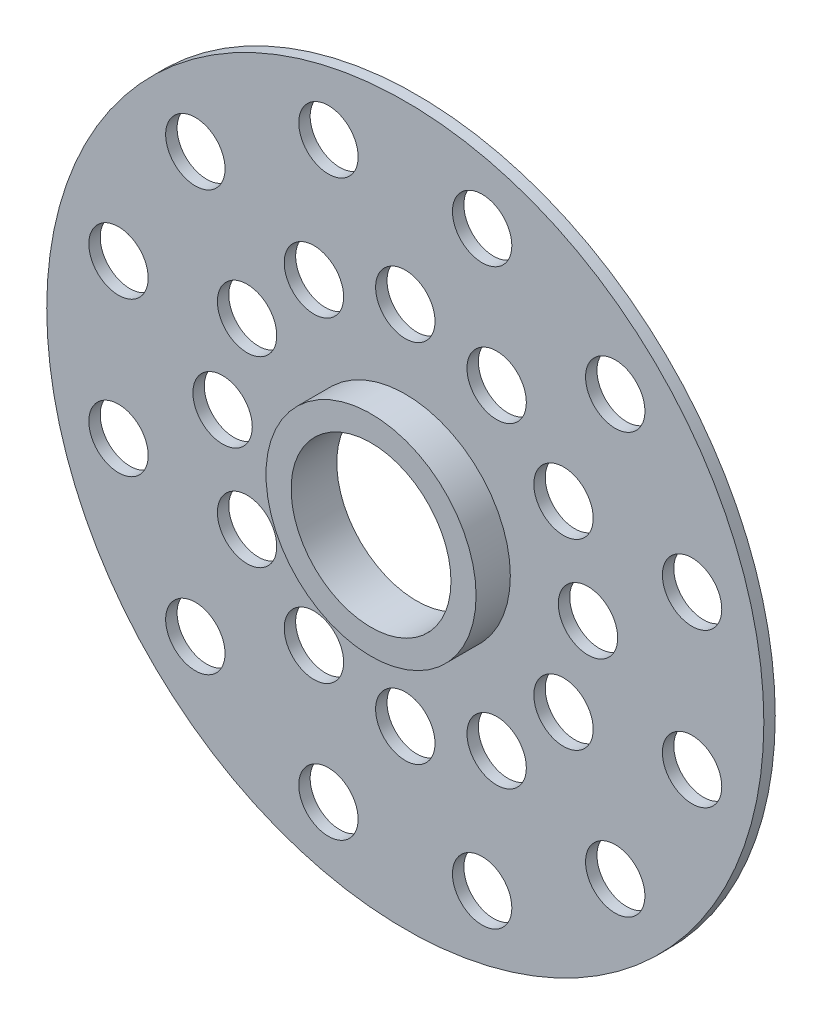
ISO-10303-21;
HEADER;
FILE_DESCRIPTION(('STEP AP214'),'2;1');
FILE_NAME('part.step','',(''),(''),'','','');
FILE_SCHEMA(('AUTOMOTIVE_DESIGN { 1 0 10303 214 1 1 1 1 }'));
ENDSEC;
DATA;
#1=APPLICATION_CONTEXT('core data for automotive mechanical design processes');
#2=APPLICATION_PROTOCOL_DEFINITION('international standard','automotive_design',2000,#1);
#3=PRODUCT_CONTEXT('',#1,'mechanical');
#4=PRODUCT('Part','Part','',(#3));
#5=PRODUCT_RELATED_PRODUCT_CATEGORY('part','',(#4));
#6=PRODUCT_DEFINITION_FORMATION('','',#4);
#7=PRODUCT_DEFINITION_CONTEXT('part definition',#1,'design');
#8=PRODUCT_DEFINITION('design','',#6,#7);
#9=PRODUCT_DEFINITION_SHAPE('','',#8);
#10=(LENGTH_UNIT() NAMED_UNIT(*) SI_UNIT(.MILLI.,.METRE.));
#11=(NAMED_UNIT(*) PLANE_ANGLE_UNIT() SI_UNIT($,.RADIAN.));
#12=(NAMED_UNIT(*) SI_UNIT($,.STERADIAN.) SOLID_ANGLE_UNIT());
#13=UNCERTAINTY_MEASURE_WITH_UNIT(LENGTH_MEASURE(1.E-05),#10,'distance_accuracy_value','');
#14=(GEOMETRIC_REPRESENTATION_CONTEXT(3) GLOBAL_UNCERTAINTY_ASSIGNED_CONTEXT((#13)) GLOBAL_UNIT_ASSIGNED_CONTEXT((#10,
#11,#12)) REPRESENTATION_CONTEXT('',''));
#15=CARTESIAN_POINT('',(0.,0.,0.));
#16=DIRECTION('',(0.,0.,1.));
#17=DIRECTION('',(1.,0.,0.));
#18=AXIS2_PLACEMENT_3D('',#15,#16,#17);
#19=CARTESIAN_POINT('',(0.,0.,-44.5));
#20=DIRECTION('',(0.,0.,1.));
#21=DIRECTION('',(1.,0.,0.));
#22=AXIS2_PLACEMENT_3D('',#19,#20,#21);
#23=PLANE('',#22);
#24=CARTESIAN_POINT('',(-45.9619407771256,45.9619407771256,-44.5));
#25=DIRECTION('',(0.,0.,1.));
#26=DIRECTION('',(1.,0.,0.));
#27=AXIS2_PLACEMENT_3D('',#24,#25,#26);
#28=CIRCLE('',#27,6.5);
#29=CARTESIAN_POINT('',(-39.4619407771256,45.9619407771256,-44.5));
#30=VERTEX_POINT('',#29);
#31=EDGE_CURVE('E185',#30,#30,#28,.T.);
#32=ORIENTED_EDGE('',*,*,#31,.F.);
#33=EDGE_LOOP('',(#32));
#34=FACE_BOUND('',#33,.T.);
#35=CARTESIAN_POINT('',(-16.8232379316639,62.7851787087894,-44.5));
#36=DIRECTION('',(0.,0.,1.));
#37=DIRECTION('',(1.,0.,0.));
#38=AXIS2_PLACEMENT_3D('',#35,#36,#37);
#39=CIRCLE('',#38,6.5);
#40=CARTESIAN_POINT('',(-10.3232379316639,62.7851787087894,-44.5));
#41=VERTEX_POINT('',#40);
#42=EDGE_CURVE('E169',#41,#41,#39,.T.);
#43=ORIENTED_EDGE('',*,*,#42,.F.);
#44=EDGE_LOOP('',(#43));
#45=FACE_BOUND('',#44,.T.);
#46=CARTESIAN_POINT('',(16.8232379316638,62.7851787087894,-44.5));
#47=DIRECTION('',(0.,0.,1.));
#48=DIRECTION('',(1.,0.,0.));
#49=AXIS2_PLACEMENT_3D('',#46,#47,#48);
#50=CIRCLE('',#49,6.5);
#51=CARTESIAN_POINT('',(23.3232379316638,62.7851787087894,-44.5));
#52=VERTEX_POINT('',#51);
#53=EDGE_CURVE('E165',#52,#52,#50,.T.);
#54=ORIENTED_EDGE('',*,*,#53,.F.);
#55=EDGE_LOOP('',(#54));
#56=FACE_BOUND('',#55,.T.);
#57=CARTESIAN_POINT('',(45.9619407771256,45.9619407771256,-44.5));
#58=DIRECTION('',(0.,0.,1.));
#59=DIRECTION('',(1.,0.,0.));
#60=AXIS2_PLACEMENT_3D('',#57,#58,#59);
#61=CIRCLE('',#60,6.5);
#62=CARTESIAN_POINT('',(52.4619407771256,45.9619407771256,-44.5));
#63=VERTEX_POINT('',#62);
#64=EDGE_CURVE('E161',#63,#63,#61,.T.);
#65=ORIENTED_EDGE('',*,*,#64,.F.);
#66=EDGE_LOOP('',(#65));
#67=FACE_BOUND('',#66,.T.);
#68=CARTESIAN_POINT('',(62.7851787087894,16.8232379316638,-44.5));
#69=DIRECTION('',(0.,0.,1.));
#70=DIRECTION('',(1.,0.,0.));
#71=AXIS2_PLACEMENT_3D('',#68,#69,#70);
#72=CIRCLE('',#71,6.50000000000001);
#73=CARTESIAN_POINT('',(69.2851787087894,16.8232379316638,-44.5));
#74=VERTEX_POINT('',#73);
#75=EDGE_CURVE('E156',#74,#74,#72,.T.);
#76=ORIENTED_EDGE('',*,*,#75,.F.);
#77=EDGE_LOOP('',(#76));
#78=FACE_BOUND('',#77,.T.);
#79=CARTESIAN_POINT('',(34.6410161513775,-20.,-44.5));
#80=DIRECTION('',(0.,0.,1.));
#81=DIRECTION('',(1.,0.,0.));
#82=AXIS2_PLACEMENT_3D('',#79,#80,#81);
#83=CIRCLE('',#82,6.5);
#84=CARTESIAN_POINT('',(41.1410161513775,-20.,-44.5));
#85=VERTEX_POINT('',#84);
#86=EDGE_CURVE('E151',#85,#85,#83,.T.);
#87=ORIENTED_EDGE('',*,*,#86,.F.);
#88=EDGE_LOOP('',(#87));
#89=FACE_BOUND('',#88,.T.);
#90=CARTESIAN_POINT('',(20.,-34.6410161513775,-44.5));
#91=DIRECTION('',(0.,0.,1.));
#92=DIRECTION('',(1.,0.,0.));
#93=AXIS2_PLACEMENT_3D('',#90,#91,#92);
#94=CIRCLE('',#93,6.5);
#95=CARTESIAN_POINT('',(26.5,-34.6410161513775,-44.5));
#96=VERTEX_POINT('',#95);
#97=EDGE_CURVE('E146',#96,#96,#94,.T.);
#98=ORIENTED_EDGE('',*,*,#97,.F.);
#99=EDGE_LOOP('',(#98));
#100=FACE_BOUND('',#99,.T.);
#101=CARTESIAN_POINT('',(0.,-40.,-44.5));
#102=DIRECTION('',(0.,0.,1.));
#103=DIRECTION('',(1.,0.,0.));
#104=AXIS2_PLACEMENT_3D('',#101,#102,#103);
#105=CIRCLE('',#104,6.5);
#106=CARTESIAN_POINT('',(6.49999999999999,-40.,-44.5));
#107=VERTEX_POINT('',#106);
#108=EDGE_CURVE('E141',#107,#107,#105,.T.);
#109=ORIENTED_EDGE('',*,*,#108,.F.);
#110=EDGE_LOOP('',(#109));
#111=FACE_BOUND('',#110,.T.);
#112=CARTESIAN_POINT('',(34.6410161513775,20.,-44.5));
#113=DIRECTION('',(0.,0.,1.));
#114=DIRECTION('',(1.,0.,0.));
#115=AXIS2_PLACEMENT_3D('',#112,#113,#114);
#116=CIRCLE('',#115,6.5);
#117=CARTESIAN_POINT('',(41.1410161513775,20.,-44.5));
#118=VERTEX_POINT('',#117);
#119=EDGE_CURVE('E136',#118,#118,#116,.T.);
#120=ORIENTED_EDGE('',*,*,#119,.F.);
#121=EDGE_LOOP('',(#120));
#122=FACE_BOUND('',#121,.T.);
#123=CARTESIAN_POINT('',(20.,34.6410161513775,-44.5));
#124=DIRECTION('',(0.,0.,1.));
#125=DIRECTION('',(1.,0.,0.));
#126=AXIS2_PLACEMENT_3D('',#123,#124,#125);
#127=CIRCLE('',#126,6.5);
#128=CARTESIAN_POINT('',(26.5,34.6410161513775,-44.5));
#129=VERTEX_POINT('',#128);
#130=EDGE_CURVE('E131',#129,#129,#127,.T.);
#131=ORIENTED_EDGE('',*,*,#130,.F.);
#132=EDGE_LOOP('',(#131));
#133=FACE_BOUND('',#132,.T.);
#134=CARTESIAN_POINT('',(0.,40.,-44.5));
#135=DIRECTION('',(0.,0.,1.));
#136=DIRECTION('',(1.,0.,0.));
#137=AXIS2_PLACEMENT_3D('',#134,#135,#136);
#138=CIRCLE('',#137,6.5);
#139=CARTESIAN_POINT('',(6.5,40.,-44.5));
#140=VERTEX_POINT('',#139);
#141=EDGE_CURVE('E126',#140,#140,#138,.T.);
#142=ORIENTED_EDGE('',*,*,#141,.F.);
#143=EDGE_LOOP('',(#142));
#144=FACE_BOUND('',#143,.T.);
#145=CARTESIAN_POINT('',(-20.,34.6410161513775,-44.5));
#146=DIRECTION('',(0.,0.,1.));
#147=DIRECTION('',(1.,0.,0.));
#148=AXIS2_PLACEMENT_3D('',#145,#146,#147);
#149=CIRCLE('',#148,6.5);
#150=CARTESIAN_POINT('',(-13.5,34.6410161513775,-44.5));
#151=VERTEX_POINT('',#150);
#152=EDGE_CURVE('E121',#151,#151,#149,.T.);
#153=ORIENTED_EDGE('',*,*,#152,.F.);
#154=EDGE_LOOP('',(#153));
#155=FACE_BOUND('',#154,.T.);
#156=CARTESIAN_POINT('',(-34.6410161513775,20.,-44.5));
#157=DIRECTION('',(0.,0.,1.));
#158=DIRECTION('',(1.,0.,0.));
#159=AXIS2_PLACEMENT_3D('',#156,#157,#158);
#160=CIRCLE('',#159,6.5);
#161=CARTESIAN_POINT('',(-28.1410161513775,20.,-44.5));
#162=VERTEX_POINT('',#161);
#163=EDGE_CURVE('E116',#162,#162,#160,.T.);
#164=ORIENTED_EDGE('',*,*,#163,.F.);
#165=EDGE_LOOP('',(#164));
#166=FACE_BOUND('',#165,.T.);
#167=CARTESIAN_POINT('',(-40.,0.,-44.5));
#168=DIRECTION('',(0.,0.,1.));
#169=DIRECTION('',(1.,0.,0.));
#170=AXIS2_PLACEMENT_3D('',#167,#168,#169);
#171=CIRCLE('',#170,6.5);
#172=CARTESIAN_POINT('',(-33.5,0.,-44.5));
#173=VERTEX_POINT('',#172);
#174=EDGE_CURVE('E111',#173,#173,#171,.T.);
#175=ORIENTED_EDGE('',*,*,#174,.F.);
#176=EDGE_LOOP('',(#175));
#177=FACE_BOUND('',#176,.T.);
#178=CARTESIAN_POINT('',(-34.6410161513775,-20.,-44.5));
#179=DIRECTION('',(0.,0.,1.));
#180=DIRECTION('',(1.,0.,0.));
#181=AXIS2_PLACEMENT_3D('',#178,#179,#180);
#182=CIRCLE('',#181,6.5);
#183=CARTESIAN_POINT('',(-28.1410161513775,-20.,-44.5));
#184=VERTEX_POINT('',#183);
#185=EDGE_CURVE('E106',#184,#184,#182,.T.);
#186=ORIENTED_EDGE('',*,*,#185,.F.);
#187=EDGE_LOOP('',(#186));
#188=FACE_BOUND('',#187,.T.);
#189=CARTESIAN_POINT('',(-20.,-34.6410161513775,-44.5));
#190=DIRECTION('',(0.,0.,1.));
#191=DIRECTION('',(1.,0.,0.));
#192=AXIS2_PLACEMENT_3D('',#189,#190,#191);
#193=CIRCLE('',#192,6.5);
#194=CARTESIAN_POINT('',(-13.5,-34.6410161513775,-44.5));
#195=VERTEX_POINT('',#194);
#196=EDGE_CURVE('E101',#195,#195,#193,.T.);
#197=ORIENTED_EDGE('',*,*,#196,.F.);
#198=EDGE_LOOP('',(#197));
#199=FACE_BOUND('',#198,.T.);
#200=CARTESIAN_POINT('',(-62.7851787087894,16.8232379316639,-44.5));
#201=DIRECTION('',(0.,0.,1.));
#202=DIRECTION('',(1.,0.,0.));
#203=AXIS2_PLACEMENT_3D('',#200,#201,#202);
#204=CIRCLE('',#203,6.5);
#205=CARTESIAN_POINT('',(-56.2851787087894,16.8232379316639,-44.5));
#206=VERTEX_POINT('',#205);
#207=EDGE_CURVE('E96',#206,#206,#204,.T.);
#208=ORIENTED_EDGE('',*,*,#207,.F.);
#209=EDGE_LOOP('',(#208));
#210=FACE_BOUND('',#209,.T.);
#211=CARTESIAN_POINT('',(-62.7851787087894,-16.8232379316638,-44.5));
#212=DIRECTION('',(0.,0.,1.));
#213=DIRECTION('',(1.,0.,0.));
#214=AXIS2_PLACEMENT_3D('',#211,#212,#213);
#215=CIRCLE('',#214,6.5);
#216=CARTESIAN_POINT('',(-56.2851787087894,-16.8232379316638,-44.5));
#217=VERTEX_POINT('',#216);
#218=EDGE_CURVE('E91',#217,#217,#215,.T.);
#219=ORIENTED_EDGE('',*,*,#218,.F.);
#220=EDGE_LOOP('',(#219));
#221=FACE_BOUND('',#220,.T.);
#222=CARTESIAN_POINT('',(-45.9619407771256,-45.9619407771256,-44.5));
#223=DIRECTION('',(0.,0.,1.));
#224=DIRECTION('',(1.,0.,0.));
#225=AXIS2_PLACEMENT_3D('',#222,#223,#224);
#226=CIRCLE('',#225,6.5);
#227=CARTESIAN_POINT('',(-39.4619407771256,-45.9619407771256,-44.5));
#228=VERTEX_POINT('',#227);
#229=EDGE_CURVE('E87',#228,#228,#226,.T.);
#230=ORIENTED_EDGE('',*,*,#229,.F.);
#231=EDGE_LOOP('',(#230));
#232=FACE_BOUND('',#231,.T.);
#233=CARTESIAN_POINT('',(-16.8232379316638,-62.7851787087894,-44.5));
#234=DIRECTION('',(0.,0.,1.));
#235=DIRECTION('',(1.,0.,0.));
#236=AXIS2_PLACEMENT_3D('',#233,#234,#235);
#237=CIRCLE('',#236,6.5);
#238=CARTESIAN_POINT('',(-10.3232379316638,-62.7851787087894,-44.5));
#239=VERTEX_POINT('',#238);
#240=EDGE_CURVE('E82',#239,#239,#237,.T.);
#241=ORIENTED_EDGE('',*,*,#240,.F.);
#242=EDGE_LOOP('',(#241));
#243=FACE_BOUND('',#242,.T.);
#244=CARTESIAN_POINT('',(16.8232379316639,-62.7851787087894,-44.5));
#245=DIRECTION('',(0.,0.,1.));
#246=DIRECTION('',(1.,0.,0.));
#247=AXIS2_PLACEMENT_3D('',#244,#245,#246);
#248=CIRCLE('',#247,6.5);
#249=CARTESIAN_POINT('',(23.3232379316639,-62.7851787087894,-44.5));
#250=VERTEX_POINT('',#249);
#251=EDGE_CURVE('E77',#250,#250,#248,.T.);
#252=ORIENTED_EDGE('',*,*,#251,.F.);
#253=EDGE_LOOP('',(#252));
#254=FACE_BOUND('',#253,.T.);
#255=CARTESIAN_POINT('',(45.9619407771256,-45.9619407771256,-44.5));
#256=DIRECTION('',(0.,0.,1.));
#257=DIRECTION('',(1.,0.,0.));
#258=AXIS2_PLACEMENT_3D('',#255,#256,#257);
#259=CIRCLE('',#258,6.5);
#260=CARTESIAN_POINT('',(52.4619407771256,-45.9619407771256,-44.5));
#261=VERTEX_POINT('',#260);
#262=EDGE_CURVE('E72',#261,#261,#259,.T.);
#263=ORIENTED_EDGE('',*,*,#262,.F.);
#264=EDGE_LOOP('',(#263));
#265=FACE_BOUND('',#264,.T.);
#266=CARTESIAN_POINT('',(62.7851787087894,-16.8232379316638,-44.5));
#267=DIRECTION('',(0.,0.,1.));
#268=DIRECTION('',(1.,0.,0.));
#269=AXIS2_PLACEMENT_3D('',#266,#267,#268);
#270=CIRCLE('',#269,6.50000000000001);
#271=CARTESIAN_POINT('',(69.2851787087894,-16.8232379316638,-44.5));
#272=VERTEX_POINT('',#271);
#273=EDGE_CURVE('E67',#272,#272,#270,.T.);
#274=ORIENTED_EDGE('',*,*,#273,.F.);
#275=EDGE_LOOP('',(#274));
#276=FACE_BOUND('',#275,.T.);
#277=CARTESIAN_POINT('',(40.,0.,-44.5));
#278=DIRECTION('',(0.,0.,1.));
#279=DIRECTION('',(1.,0.,0.));
#280=AXIS2_PLACEMENT_3D('',#277,#278,#279);
#281=CIRCLE('',#280,6.5);
#282=CARTESIAN_POINT('',(46.5,0.,-44.5));
#283=VERTEX_POINT('',#282);
#284=EDGE_CURVE('E62',#283,#283,#281,.T.);
#285=ORIENTED_EDGE('',*,*,#284,.F.);
#286=EDGE_LOOP('',(#285));
#287=FACE_BOUND('',#286,.T.);
#288=CARTESIAN_POINT('',(0.,0.,-44.5));
#289=DIRECTION('',(0.,0.,1.));
#290=DIRECTION('',(1.,0.,0.));
#291=AXIS2_PLACEMENT_3D('',#288,#289,#290);
#292=CIRCLE('',#291,78.5);
#293=CARTESIAN_POINT('',(78.5,0.,-44.5));
#294=VERTEX_POINT('',#293);
#295=EDGE_CURVE('E10',#294,#294,#292,.T.);
#296=ORIENTED_EDGE('',*,*,#295,.T.);
#297=EDGE_LOOP('',(#296));
#298=FACE_BOUND('',#297,.T.);
#299=CARTESIAN_POINT('',(0.,0.,-44.5));
#300=DIRECTION('',(0.,0.,1.));
#301=DIRECTION('',(1.,0.,0.));
#302=AXIS2_PLACEMENT_3D('',#299,#300,#301);
#303=CIRCLE('',#302,23.);
#304=CARTESIAN_POINT('',(23.,0.,-44.5));
#305=VERTEX_POINT('',#304);
#306=EDGE_CURVE('E196',#305,#305,#303,.F.);
#307=ORIENTED_EDGE('',*,*,#306,.T.);
#308=EDGE_LOOP('',(#307));
#309=FACE_BOUND('',#308,.T.);
#310=ADVANCED_FACE('F36',(#34,#45,#56,#67,#78,#89,#100,#111,#122,#133,#144,#155,#166,#177,#188,
#199,#210,#221,#232,#243,#254,#265,#276,#287,#298,#309),#23,.T.);
#311=CARTESIAN_POINT('',(0.,0.,-47.));
#312=DIRECTION('',(0.,0.,1.));
#313=DIRECTION('',(1.,0.,0.));
#314=AXIS2_PLACEMENT_3D('',#311,#312,#313);
#315=PLANE('',#314);
#316=CARTESIAN_POINT('',(-45.9619407771256,45.9619407771256,-47.));
#317=DIRECTION('',(0.,0.,1.));
#318=DIRECTION('',(1.,0.,0.));
#319=AXIS2_PLACEMENT_3D('',#316,#317,#318);
#320=CIRCLE('',#319,6.5);
#321=CARTESIAN_POINT('',(-39.4619407771256,45.9619407771256,-47.));
#322=VERTEX_POINT('',#321);
#323=EDGE_CURVE('E40',#322,#322,#320,.T.);
#324=ORIENTED_EDGE('',*,*,#323,.T.);
#325=EDGE_LOOP('',(#324));
#326=FACE_BOUND('',#325,.T.);
#327=CARTESIAN_POINT('',(-16.8232379316639,62.7851787087894,-47.));
#328=DIRECTION('',(0.,0.,1.));
#329=DIRECTION('',(1.,0.,0.));
#330=AXIS2_PLACEMENT_3D('',#327,#328,#329);
#331=CIRCLE('',#330,6.5);
#332=CARTESIAN_POINT('',(-10.3232379316639,62.7851787087894,-47.));
#333=VERTEX_POINT('',#332);
#334=EDGE_CURVE('E166',#333,#333,#331,.T.);
#335=ORIENTED_EDGE('',*,*,#334,.T.);
#336=EDGE_LOOP('',(#335));
#337=FACE_BOUND('',#336,.T.);
#338=CARTESIAN_POINT('',(16.8232379316638,62.7851787087894,-47.));
#339=DIRECTION('',(0.,0.,1.));
#340=DIRECTION('',(1.,0.,0.));
#341=AXIS2_PLACEMENT_3D('',#338,#339,#340);
#342=CIRCLE('',#341,6.5);
#343=CARTESIAN_POINT('',(23.3232379316638,62.7851787087894,-47.));
#344=VERTEX_POINT('',#343);
#345=EDGE_CURVE('E162',#344,#344,#342,.T.);
#346=ORIENTED_EDGE('',*,*,#345,.T.);
#347=EDGE_LOOP('',(#346));
#348=FACE_BOUND('',#347,.T.);
#349=CARTESIAN_POINT('',(45.9619407771256,45.9619407771256,-47.));
#350=DIRECTION('',(0.,0.,1.));
#351=DIRECTION('',(1.,0.,0.));
#352=AXIS2_PLACEMENT_3D('',#349,#350,#351);
#353=CIRCLE('',#352,6.5);
#354=CARTESIAN_POINT('',(52.4619407771256,45.9619407771256,-47.));
#355=VERTEX_POINT('',#354);
#356=EDGE_CURVE('E157',#355,#355,#353,.T.);
#357=ORIENTED_EDGE('',*,*,#356,.T.);
#358=EDGE_LOOP('',(#357));
#359=FACE_BOUND('',#358,.T.);
#360=CARTESIAN_POINT('',(62.7851787087894,16.8232379316638,-47.));
#361=DIRECTION('',(0.,0.,1.));
#362=DIRECTION('',(1.,0.,0.));
#363=AXIS2_PLACEMENT_3D('',#360,#361,#362);
#364=CIRCLE('',#363,6.50000000000001);
#365=CARTESIAN_POINT('',(69.2851787087894,16.8232379316638,-47.));
#366=VERTEX_POINT('',#365);
#367=EDGE_CURVE('E152',#366,#366,#364,.T.);
#368=ORIENTED_EDGE('',*,*,#367,.T.);
#369=EDGE_LOOP('',(#368));
#370=FACE_BOUND('',#369,.T.);
#371=CARTESIAN_POINT('',(34.6410161513775,-20.,-47.));
#372=DIRECTION('',(0.,0.,1.));
#373=DIRECTION('',(1.,0.,0.));
#374=AXIS2_PLACEMENT_3D('',#371,#372,#373);
#375=CIRCLE('',#374,6.5);
#376=CARTESIAN_POINT('',(41.1410161513775,-20.,-47.));
#377=VERTEX_POINT('',#376);
#378=EDGE_CURVE('E147',#377,#377,#375,.T.);
#379=ORIENTED_EDGE('',*,*,#378,.T.);
#380=EDGE_LOOP('',(#379));
#381=FACE_BOUND('',#380,.T.);
#382=CARTESIAN_POINT('',(20.,-34.6410161513775,-47.));
#383=DIRECTION('',(0.,0.,1.));
#384=DIRECTION('',(1.,0.,0.));
#385=AXIS2_PLACEMENT_3D('',#382,#383,#384);
#386=CIRCLE('',#385,6.5);
#387=CARTESIAN_POINT('',(26.5,-34.6410161513775,-47.));
#388=VERTEX_POINT('',#387);
#389=EDGE_CURVE('E142',#388,#388,#386,.T.);
#390=ORIENTED_EDGE('',*,*,#389,.T.);
#391=EDGE_LOOP('',(#390));
#392=FACE_BOUND('',#391,.T.);
#393=CARTESIAN_POINT('',(0.,-40.,-47.));
#394=DIRECTION('',(0.,0.,1.));
#395=DIRECTION('',(1.,0.,0.));
#396=AXIS2_PLACEMENT_3D('',#393,#394,#395);
#397=CIRCLE('',#396,6.5);
#398=CARTESIAN_POINT('',(6.49999999999999,-40.,-47.));
#399=VERTEX_POINT('',#398);
#400=EDGE_CURVE('E137',#399,#399,#397,.T.);
#401=ORIENTED_EDGE('',*,*,#400,.T.);
#402=EDGE_LOOP('',(#401));
#403=FACE_BOUND('',#402,.T.);
#404=CARTESIAN_POINT('',(34.6410161513775,20.,-47.));
#405=DIRECTION('',(0.,0.,1.));
#406=DIRECTION('',(1.,0.,0.));
#407=AXIS2_PLACEMENT_3D('',#404,#405,#406);
#408=CIRCLE('',#407,6.5);
#409=CARTESIAN_POINT('',(41.1410161513775,20.,-47.));
#410=VERTEX_POINT('',#409);
#411=EDGE_CURVE('E132',#410,#410,#408,.T.);
#412=ORIENTED_EDGE('',*,*,#411,.T.);
#413=EDGE_LOOP('',(#412));
#414=FACE_BOUND('',#413,.T.);
#415=CARTESIAN_POINT('',(20.,34.6410161513775,-47.));
#416=DIRECTION('',(0.,0.,1.));
#417=DIRECTION('',(1.,0.,0.));
#418=AXIS2_PLACEMENT_3D('',#415,#416,#417);
#419=CIRCLE('',#418,6.5);
#420=CARTESIAN_POINT('',(26.5,34.6410161513775,-47.));
#421=VERTEX_POINT('',#420);
#422=EDGE_CURVE('E127',#421,#421,#419,.T.);
#423=ORIENTED_EDGE('',*,*,#422,.T.);
#424=EDGE_LOOP('',(#423));
#425=FACE_BOUND('',#424,.T.);
#426=CARTESIAN_POINT('',(0.,40.,-47.));
#427=DIRECTION('',(0.,0.,1.));
#428=DIRECTION('',(1.,0.,0.));
#429=AXIS2_PLACEMENT_3D('',#426,#427,#428);
#430=CIRCLE('',#429,6.5);
#431=CARTESIAN_POINT('',(6.5,40.,-47.));
#432=VERTEX_POINT('',#431);
#433=EDGE_CURVE('E122',#432,#432,#430,.T.);
#434=ORIENTED_EDGE('',*,*,#433,.T.);
#435=EDGE_LOOP('',(#434));
#436=FACE_BOUND('',#435,.T.);
#437=CARTESIAN_POINT('',(-20.,34.6410161513775,-47.));
#438=DIRECTION('',(0.,0.,1.));
#439=DIRECTION('',(1.,0.,0.));
#440=AXIS2_PLACEMENT_3D('',#437,#438,#439);
#441=CIRCLE('',#440,6.5);
#442=CARTESIAN_POINT('',(-13.5,34.6410161513775,-47.));
#443=VERTEX_POINT('',#442);
#444=EDGE_CURVE('E117',#443,#443,#441,.T.);
#445=ORIENTED_EDGE('',*,*,#444,.T.);
#446=EDGE_LOOP('',(#445));
#447=FACE_BOUND('',#446,.T.);
#448=CARTESIAN_POINT('',(-34.6410161513775,20.,-47.));
#449=DIRECTION('',(0.,0.,1.));
#450=DIRECTION('',(1.,0.,0.));
#451=AXIS2_PLACEMENT_3D('',#448,#449,#450);
#452=CIRCLE('',#451,6.5);
#453=CARTESIAN_POINT('',(-28.1410161513775,20.,-47.));
#454=VERTEX_POINT('',#453);
#455=EDGE_CURVE('E112',#454,#454,#452,.T.);
#456=ORIENTED_EDGE('',*,*,#455,.T.);
#457=EDGE_LOOP('',(#456));
#458=FACE_BOUND('',#457,.T.);
#459=CARTESIAN_POINT('',(-40.,0.,-47.));
#460=DIRECTION('',(0.,0.,1.));
#461=DIRECTION('',(1.,0.,0.));
#462=AXIS2_PLACEMENT_3D('',#459,#460,#461);
#463=CIRCLE('',#462,6.5);
#464=CARTESIAN_POINT('',(-33.5,0.,-47.));
#465=VERTEX_POINT('',#464);
#466=EDGE_CURVE('E107',#465,#465,#463,.T.);
#467=ORIENTED_EDGE('',*,*,#466,.T.);
#468=EDGE_LOOP('',(#467));
#469=FACE_BOUND('',#468,.T.);
#470=CARTESIAN_POINT('',(-34.6410161513775,-20.,-47.));
#471=DIRECTION('',(0.,0.,1.));
#472=DIRECTION('',(1.,0.,0.));
#473=AXIS2_PLACEMENT_3D('',#470,#471,#472);
#474=CIRCLE('',#473,6.5);
#475=CARTESIAN_POINT('',(-28.1410161513775,-20.,-47.));
#476=VERTEX_POINT('',#475);
#477=EDGE_CURVE('E102',#476,#476,#474,.T.);
#478=ORIENTED_EDGE('',*,*,#477,.T.);
#479=EDGE_LOOP('',(#478));
#480=FACE_BOUND('',#479,.T.);
#481=CARTESIAN_POINT('',(-20.,-34.6410161513775,-47.));
#482=DIRECTION('',(0.,0.,1.));
#483=DIRECTION('',(1.,0.,0.));
#484=AXIS2_PLACEMENT_3D('',#481,#482,#483);
#485=CIRCLE('',#484,6.5);
#486=CARTESIAN_POINT('',(-13.5,-34.6410161513775,-47.));
#487=VERTEX_POINT('',#486);
#488=EDGE_CURVE('E97',#487,#487,#485,.T.);
#489=ORIENTED_EDGE('',*,*,#488,.T.);
#490=EDGE_LOOP('',(#489));
#491=FACE_BOUND('',#490,.T.);
#492=CARTESIAN_POINT('',(-62.7851787087894,16.8232379316639,-47.));
#493=DIRECTION('',(0.,0.,1.));
#494=DIRECTION('',(1.,0.,0.));
#495=AXIS2_PLACEMENT_3D('',#492,#493,#494);
#496=CIRCLE('',#495,6.5);
#497=CARTESIAN_POINT('',(-56.2851787087894,16.8232379316639,-47.));
#498=VERTEX_POINT('',#497);
#499=EDGE_CURVE('E92',#498,#498,#496,.T.);
#500=ORIENTED_EDGE('',*,*,#499,.T.);
#501=EDGE_LOOP('',(#500));
#502=FACE_BOUND('',#501,.T.);
#503=CARTESIAN_POINT('',(-62.7851787087894,-16.8232379316638,-47.));
#504=DIRECTION('',(0.,0.,1.));
#505=DIRECTION('',(1.,0.,0.));
#506=AXIS2_PLACEMENT_3D('',#503,#504,#505);
#507=CIRCLE('',#506,6.5);
#508=CARTESIAN_POINT('',(-56.2851787087894,-16.8232379316638,-47.));
#509=VERTEX_POINT('',#508);
#510=EDGE_CURVE('E88',#509,#509,#507,.T.);
#511=ORIENTED_EDGE('',*,*,#510,.T.);
#512=EDGE_LOOP('',(#511));
#513=FACE_BOUND('',#512,.T.);
#514=CARTESIAN_POINT('',(-45.9619407771256,-45.9619407771256,-47.));
#515=DIRECTION('',(0.,0.,1.));
#516=DIRECTION('',(1.,0.,0.));
#517=AXIS2_PLACEMENT_3D('',#514,#515,#516);
#518=CIRCLE('',#517,6.5);
#519=CARTESIAN_POINT('',(-39.4619407771256,-45.9619407771256,-47.));
#520=VERTEX_POINT('',#519);
#521=EDGE_CURVE('E83',#520,#520,#518,.T.);
#522=ORIENTED_EDGE('',*,*,#521,.T.);
#523=EDGE_LOOP('',(#522));
#524=FACE_BOUND('',#523,.T.);
#525=CARTESIAN_POINT('',(-16.8232379316638,-62.7851787087894,-47.));
#526=DIRECTION('',(0.,0.,1.));
#527=DIRECTION('',(1.,0.,0.));
#528=AXIS2_PLACEMENT_3D('',#525,#526,#527);
#529=CIRCLE('',#528,6.5);
#530=CARTESIAN_POINT('',(-10.3232379316638,-62.7851787087894,-47.));
#531=VERTEX_POINT('',#530);
#532=EDGE_CURVE('E78',#531,#531,#529,.T.);
#533=ORIENTED_EDGE('',*,*,#532,.T.);
#534=EDGE_LOOP('',(#533));
#535=FACE_BOUND('',#534,.T.);
#536=CARTESIAN_POINT('',(16.8232379316639,-62.7851787087894,-47.));
#537=DIRECTION('',(0.,0.,1.));
#538=DIRECTION('',(1.,0.,0.));
#539=AXIS2_PLACEMENT_3D('',#536,#537,#538);
#540=CIRCLE('',#539,6.5);
#541=CARTESIAN_POINT('',(23.3232379316639,-62.7851787087894,-47.));
#542=VERTEX_POINT('',#541);
#543=EDGE_CURVE('E73',#542,#542,#540,.T.);
#544=ORIENTED_EDGE('',*,*,#543,.T.);
#545=EDGE_LOOP('',(#544));
#546=FACE_BOUND('',#545,.T.);
#547=CARTESIAN_POINT('',(45.9619407771256,-45.9619407771256,-47.));
#548=DIRECTION('',(0.,0.,1.));
#549=DIRECTION('',(1.,0.,0.));
#550=AXIS2_PLACEMENT_3D('',#547,#548,#549);
#551=CIRCLE('',#550,6.5);
#552=CARTESIAN_POINT('',(52.4619407771256,-45.9619407771256,-47.));
#553=VERTEX_POINT('',#552);
#554=EDGE_CURVE('E68',#553,#553,#551,.T.);
#555=ORIENTED_EDGE('',*,*,#554,.T.);
#556=EDGE_LOOP('',(#555));
#557=FACE_BOUND('',#556,.T.);
#558=CARTESIAN_POINT('',(62.7851787087894,-16.8232379316638,-47.));
#559=DIRECTION('',(0.,0.,1.));
#560=DIRECTION('',(1.,0.,0.));
#561=AXIS2_PLACEMENT_3D('',#558,#559,#560);
#562=CIRCLE('',#561,6.50000000000001);
#563=CARTESIAN_POINT('',(69.2851787087894,-16.8232379316638,-47.));
#564=VERTEX_POINT('',#563);
#565=EDGE_CURVE('E63',#564,#564,#562,.T.);
#566=ORIENTED_EDGE('',*,*,#565,.T.);
#567=EDGE_LOOP('',(#566));
#568=FACE_BOUND('',#567,.T.);
#569=CARTESIAN_POINT('',(40.,0.,-47.));
#570=DIRECTION('',(0.,0.,1.));
#571=DIRECTION('',(1.,0.,0.));
#572=AXIS2_PLACEMENT_3D('',#569,#570,#571);
#573=CIRCLE('',#572,6.5);
#574=CARTESIAN_POINT('',(46.5,0.,-47.));
#575=VERTEX_POINT('',#574);
#576=EDGE_CURVE('E58',#575,#575,#573,.T.);
#577=ORIENTED_EDGE('',*,*,#576,.T.);
#578=EDGE_LOOP('',(#577));
#579=FACE_BOUND('',#578,.T.);
#580=CARTESIAN_POINT('',(0.,0.,-47.));
#581=DIRECTION('',(0.,0.,1.));
#582=DIRECTION('',(1.,0.,0.));
#583=AXIS2_PLACEMENT_3D('',#580,#581,#582);
#584=CIRCLE('',#583,17.5);
#585=CARTESIAN_POINT('',(17.5,0.,-47.));
#586=VERTEX_POINT('',#585);
#587=EDGE_CURVE('E53',#586,#586,#584,.T.);
#588=ORIENTED_EDGE('',*,*,#587,.T.);
#589=EDGE_LOOP('',(#588));
#590=FACE_BOUND('',#589,.T.);
#591=CARTESIAN_POINT('',(0.,0.,-47.));
#592=DIRECTION('',(0.,0.,1.));
#593=DIRECTION('',(1.,0.,0.));
#594=AXIS2_PLACEMENT_3D('',#591,#592,#593);
#595=CIRCLE('',#594,78.5);
#596=CARTESIAN_POINT('',(78.5,0.,-47.));
#597=VERTEX_POINT('',#596);
#598=EDGE_CURVE('E45',#597,#597,#595,.T.);
#599=ORIENTED_EDGE('',*,*,#598,.F.);
#600=EDGE_LOOP('',(#599));
#601=FACE_BOUND('',#600,.T.);
#602=ADVANCED_FACE('F206',(#326,#337,#348,#359,#370,#381,#392,#403,#414,#425,#436,#447,#458,
#469,#480,#491,#502,#513,#524,#535,#546,#557,#568,#579,#590,#601),#315,.F.);
#603=CARTESIAN_POINT('',(0.,0.,-44.5));
#604=DIRECTION('',(0.,0.,-1.));
#605=DIRECTION('',(-1.,0.,0.));
#606=AXIS2_PLACEMENT_3D('',#603,#604,#605);
#607=CYLINDRICAL_SURFACE('',#606,78.5);
#608=ORIENTED_EDGE('',*,*,#295,.F.);
#609=EDGE_LOOP('',(#608));
#610=FACE_BOUND('',#609,.T.);
#611=ORIENTED_EDGE('',*,*,#598,.T.);
#612=EDGE_LOOP('',(#611));
#613=FACE_BOUND('',#612,.T.);
#614=ADVANCED_FACE('F38',(#610,#613),#607,.T.);
#615=CARTESIAN_POINT('',(0.,0.,-44.5));
#616=DIRECTION('',(0.,0.,-1.));
#617=DIRECTION('',(-1.,0.,0.));
#618=AXIS2_PLACEMENT_3D('',#615,#616,#617);
#619=CYLINDRICAL_SURFACE('',#618,17.5);
#620=ORIENTED_EDGE('',*,*,#587,.F.);
#621=EDGE_LOOP('',(#620));
#622=FACE_BOUND('',#621,.T.);
#623=CARTESIAN_POINT('',(0.,0.,-37.));
#624=DIRECTION('',(0.,0.,1.));
#625=DIRECTION('',(1.,0.,0.));
#626=AXIS2_PLACEMENT_3D('',#623,#624,#625);
#627=CIRCLE('',#626,17.5);
#628=CARTESIAN_POINT('',(17.5,0.,-37.));
#629=VERTEX_POINT('',#628);
#630=EDGE_CURVE('E189',#629,#629,#627,.T.);
#631=ORIENTED_EDGE('',*,*,#630,.T.);
#632=EDGE_LOOP('',(#631));
#633=FACE_BOUND('',#632,.T.);
#634=ADVANCED_FACE('F209',(#622,#633),#619,.F.);
#635=CARTESIAN_POINT('',(0.,0.,-37.));
#636=DIRECTION('',(0.,0.,1.));
#637=DIRECTION('',(1.,0.,0.));
#638=AXIS2_PLACEMENT_3D('',#635,#636,#637);
#639=PLANE('',#638);
#640=CARTESIAN_POINT('',(0.,0.,-37.));
#641=DIRECTION('',(0.,0.,1.));
#642=DIRECTION('',(1.,0.,0.));
#643=AXIS2_PLACEMENT_3D('',#640,#641,#642);
#644=CIRCLE('',#643,23.);
#645=CARTESIAN_POINT('',(23.,0.,-37.));
#646=VERTEX_POINT('',#645);
#647=EDGE_CURVE('E193',#646,#646,#644,.T.);
#648=ORIENTED_EDGE('',*,*,#647,.T.);
#649=EDGE_LOOP('',(#648));
#650=FACE_BOUND('',#649,.T.);
#651=ORIENTED_EDGE('',*,*,#630,.F.);
#652=EDGE_LOOP('',(#651));
#653=FACE_BOUND('',#652,.T.);
#654=ADVANCED_FACE('F212',(#650,#653),#639,.T.);
#655=CARTESIAN_POINT('',(0.,0.,-37.));
#656=DIRECTION('',(0.,0.,-1.));
#657=DIRECTION('',(-1.,0.,0.));
#658=AXIS2_PLACEMENT_3D('',#655,#656,#657);
#659=CYLINDRICAL_SURFACE('',#658,23.);
#660=ORIENTED_EDGE('',*,*,#306,.F.);
#661=EDGE_LOOP('',(#660));
#662=FACE_BOUND('',#661,.T.);
#663=ORIENTED_EDGE('',*,*,#647,.F.);
#664=EDGE_LOOP('',(#663));
#665=FACE_BOUND('',#664,.T.);
#666=ADVANCED_FACE('F217',(#662,#665),#659,.T.);
#667=CARTESIAN_POINT('',(40.,0.,-100.));
#668=DIRECTION('',(0.,0.,1.));
#669=DIRECTION('',(1.,0.,0.));
#670=AXIS2_PLACEMENT_3D('',#667,#668,#669);
#671=CYLINDRICAL_SURFACE('',#670,6.5);
#672=ORIENTED_EDGE('',*,*,#284,.T.);
#673=EDGE_LOOP('',(#672));
#674=FACE_BOUND('',#673,.T.);
#675=ORIENTED_EDGE('',*,*,#576,.F.);
#676=EDGE_LOOP('',(#675));
#677=FACE_BOUND('',#676,.T.);
#678=ADVANCED_FACE('F223',(#674,#677),#671,.F.);
#679=CARTESIAN_POINT('',(62.7851787087894,-16.8232379316638,-100.));
#680=DIRECTION('',(0.,0.,1.));
#681=DIRECTION('',(1.,0.,0.));
#682=AXIS2_PLACEMENT_3D('',#679,#680,#681);
#683=CYLINDRICAL_SURFACE('',#682,6.50000000000001);
#684=ORIENTED_EDGE('',*,*,#273,.T.);
#685=EDGE_LOOP('',(#684));
#686=FACE_BOUND('',#685,.T.);
#687=ORIENTED_EDGE('',*,*,#565,.F.);
#688=EDGE_LOOP('',(#687));
#689=FACE_BOUND('',#688,.T.);
#690=ADVANCED_FACE('F386',(#686,#689),#683,.F.);
#691=CARTESIAN_POINT('',(45.9619407771256,-45.9619407771256,-100.));
#692=DIRECTION('',(0.,0.,1.));
#693=DIRECTION('',(1.,0.,0.));
#694=AXIS2_PLACEMENT_3D('',#691,#692,#693);
#695=CYLINDRICAL_SURFACE('',#694,6.5);
#696=ORIENTED_EDGE('',*,*,#262,.T.);
#697=EDGE_LOOP('',(#696));
#698=FACE_BOUND('',#697,.T.);
#699=ORIENTED_EDGE('',*,*,#554,.F.);
#700=EDGE_LOOP('',(#699));
#701=FACE_BOUND('',#700,.T.);
#702=ADVANCED_FACE('F390',(#698,#701),#695,.F.);
#703=CARTESIAN_POINT('',(16.8232379316639,-62.7851787087894,-100.));
#704=DIRECTION('',(0.,0.,1.));
#705=DIRECTION('',(1.,0.,0.));
#706=AXIS2_PLACEMENT_3D('',#703,#704,#705);
#707=CYLINDRICAL_SURFACE('',#706,6.5);
#708=ORIENTED_EDGE('',*,*,#251,.T.);
#709=EDGE_LOOP('',(#708));
#710=FACE_BOUND('',#709,.T.);
#711=ORIENTED_EDGE('',*,*,#543,.F.);
#712=EDGE_LOOP('',(#711));
#713=FACE_BOUND('',#712,.T.);
#714=ADVANCED_FACE('F454',(#710,#713),#707,.F.);
#715=CARTESIAN_POINT('',(-16.8232379316638,-62.7851787087894,-100.));
#716=DIRECTION('',(0.,0.,1.));
#717=DIRECTION('',(1.,0.,0.));
#718=AXIS2_PLACEMENT_3D('',#715,#716,#717);
#719=CYLINDRICAL_SURFACE('',#718,6.5);
#720=ORIENTED_EDGE('',*,*,#240,.T.);
#721=EDGE_LOOP('',(#720));
#722=FACE_BOUND('',#721,.T.);
#723=ORIENTED_EDGE('',*,*,#532,.F.);
#724=EDGE_LOOP('',(#723));
#725=FACE_BOUND('',#724,.T.);
#726=ADVANCED_FACE('F458',(#722,#725),#719,.F.);
#727=CARTESIAN_POINT('',(-45.9619407771256,-45.9619407771256,-100.));
#728=DIRECTION('',(0.,0.,1.));
#729=DIRECTION('',(1.,0.,0.));
#730=AXIS2_PLACEMENT_3D('',#727,#728,#729);
#731=CYLINDRICAL_SURFACE('',#730,6.5);
#732=ORIENTED_EDGE('',*,*,#229,.T.);
#733=EDGE_LOOP('',(#732));
#734=FACE_BOUND('',#733,.T.);
#735=ORIENTED_EDGE('',*,*,#521,.F.);
#736=EDGE_LOOP('',(#735));
#737=FACE_BOUND('',#736,.T.);
#738=ADVANCED_FACE('F462',(#734,#737),#731,.F.);
#739=CARTESIAN_POINT('',(-62.7851787087894,-16.8232379316638,-100.));
#740=DIRECTION('',(0.,0.,1.));
#741=DIRECTION('',(1.,0.,0.));
#742=AXIS2_PLACEMENT_3D('',#739,#740,#741);
#743=CYLINDRICAL_SURFACE('',#742,6.5);
#744=ORIENTED_EDGE('',*,*,#218,.T.);
#745=EDGE_LOOP('',(#744));
#746=FACE_BOUND('',#745,.T.);
#747=ORIENTED_EDGE('',*,*,#510,.F.);
#748=EDGE_LOOP('',(#747));
#749=FACE_BOUND('',#748,.T.);
#750=ADVANCED_FACE('F466',(#746,#749),#743,.F.);
#751=CARTESIAN_POINT('',(-62.7851787087894,16.8232379316639,-100.));
#752=DIRECTION('',(0.,0.,1.));
#753=DIRECTION('',(1.,0.,0.));
#754=AXIS2_PLACEMENT_3D('',#751,#752,#753);
#755=CYLINDRICAL_SURFACE('',#754,6.5);
#756=ORIENTED_EDGE('',*,*,#207,.T.);
#757=EDGE_LOOP('',(#756));
#758=FACE_BOUND('',#757,.T.);
#759=ORIENTED_EDGE('',*,*,#499,.F.);
#760=EDGE_LOOP('',(#759));
#761=FACE_BOUND('',#760,.T.);
#762=ADVANCED_FACE('F416',(#758,#761),#755,.F.);
#763=CARTESIAN_POINT('',(-20.,-34.6410161513775,-100.));
#764=DIRECTION('',(0.,0.,1.));
#765=DIRECTION('',(1.,0.,0.));
#766=AXIS2_PLACEMENT_3D('',#763,#764,#765);
#767=CYLINDRICAL_SURFACE('',#766,6.5);
#768=ORIENTED_EDGE('',*,*,#196,.T.);
#769=EDGE_LOOP('',(#768));
#770=FACE_BOUND('',#769,.T.);
#771=ORIENTED_EDGE('',*,*,#488,.F.);
#772=EDGE_LOOP('',(#771));
#773=FACE_BOUND('',#772,.T.);
#774=ADVANCED_FACE('F412',(#770,#773),#767,.F.);
#775=CARTESIAN_POINT('',(-34.6410161513775,-20.,-100.));
#776=DIRECTION('',(0.,0.,1.));
#777=DIRECTION('',(1.,0.,0.));
#778=AXIS2_PLACEMENT_3D('',#775,#776,#777);
#779=CYLINDRICAL_SURFACE('',#778,6.5);
#780=ORIENTED_EDGE('',*,*,#185,.T.);
#781=EDGE_LOOP('',(#780));
#782=FACE_BOUND('',#781,.T.);
#783=ORIENTED_EDGE('',*,*,#477,.F.);
#784=EDGE_LOOP('',(#783));
#785=FACE_BOUND('',#784,.T.);
#786=ADVANCED_FACE('F415',(#782,#785),#779,.F.);
#787=CARTESIAN_POINT('',(-40.,0.,-100.));
#788=DIRECTION('',(0.,0.,1.));
#789=DIRECTION('',(1.,0.,0.));
#790=AXIS2_PLACEMENT_3D('',#787,#788,#789);
#791=CYLINDRICAL_SURFACE('',#790,6.5);
#792=ORIENTED_EDGE('',*,*,#174,.T.);
#793=EDGE_LOOP('',(#792));
#794=FACE_BOUND('',#793,.T.);
#795=ORIENTED_EDGE('',*,*,#466,.F.);
#796=EDGE_LOOP('',(#795));
#797=FACE_BOUND('',#796,.T.);
#798=ADVANCED_FACE('F420',(#794,#797),#791,.F.);
#799=CARTESIAN_POINT('',(-34.6410161513775,20.,-100.));
#800=DIRECTION('',(0.,0.,1.));
#801=DIRECTION('',(1.,0.,0.));
#802=AXIS2_PLACEMENT_3D('',#799,#800,#801);
#803=CYLINDRICAL_SURFACE('',#802,6.5);
#804=ORIENTED_EDGE('',*,*,#163,.T.);
#805=EDGE_LOOP('',(#804));
#806=FACE_BOUND('',#805,.T.);
#807=ORIENTED_EDGE('',*,*,#455,.F.);
#808=EDGE_LOOP('',(#807));
#809=FACE_BOUND('',#808,.T.);
#810=ADVANCED_FACE('F398',(#806,#809),#803,.F.);
#811=CARTESIAN_POINT('',(-20.,34.6410161513775,-100.));
#812=DIRECTION('',(0.,0.,1.));
#813=DIRECTION('',(1.,0.,0.));
#814=AXIS2_PLACEMENT_3D('',#811,#812,#813);
#815=CYLINDRICAL_SURFACE('',#814,6.5);
#816=ORIENTED_EDGE('',*,*,#152,.T.);
#817=EDGE_LOOP('',(#816));
#818=FACE_BOUND('',#817,.T.);
#819=ORIENTED_EDGE('',*,*,#444,.F.);
#820=EDGE_LOOP('',(#819));
#821=FACE_BOUND('',#820,.T.);
#822=ADVANCED_FACE('F394',(#818,#821),#815,.F.);
#823=CARTESIAN_POINT('',(0.,40.,-100.));
#824=DIRECTION('',(0.,0.,1.));
#825=DIRECTION('',(1.,0.,0.));
#826=AXIS2_PLACEMENT_3D('',#823,#824,#825);
#827=CYLINDRICAL_SURFACE('',#826,6.5);
#828=ORIENTED_EDGE('',*,*,#141,.T.);
#829=EDGE_LOOP('',(#828));
#830=FACE_BOUND('',#829,.T.);
#831=ORIENTED_EDGE('',*,*,#433,.F.);
#832=EDGE_LOOP('',(#831));
#833=FACE_BOUND('',#832,.T.);
#834=ADVANCED_FACE('F397',(#830,#833),#827,.F.);
#835=CARTESIAN_POINT('',(20.,34.6410161513775,-100.));
#836=DIRECTION('',(0.,0.,1.));
#837=DIRECTION('',(1.,0.,0.));
#838=AXIS2_PLACEMENT_3D('',#835,#836,#837);
#839=CYLINDRICAL_SURFACE('',#838,6.5);
#840=ORIENTED_EDGE('',*,*,#130,.T.);
#841=EDGE_LOOP('',(#840));
#842=FACE_BOUND('',#841,.T.);
#843=ORIENTED_EDGE('',*,*,#422,.F.);
#844=EDGE_LOOP('',(#843));
#845=FACE_BOUND('',#844,.T.);
#846=ADVANCED_FACE('F402',(#842,#845),#839,.F.);
#847=CARTESIAN_POINT('',(34.6410161513775,20.,-100.));
#848=DIRECTION('',(0.,0.,1.));
#849=DIRECTION('',(1.,0.,0.));
#850=AXIS2_PLACEMENT_3D('',#847,#848,#849);
#851=CYLINDRICAL_SURFACE('',#850,6.5);
#852=ORIENTED_EDGE('',*,*,#119,.T.);
#853=EDGE_LOOP('',(#852));
#854=FACE_BOUND('',#853,.T.);
#855=ORIENTED_EDGE('',*,*,#411,.F.);
#856=EDGE_LOOP('',(#855));
#857=FACE_BOUND('',#856,.T.);
#858=ADVANCED_FACE('F406',(#854,#857),#851,.F.);
#859=CARTESIAN_POINT('',(0.,-40.,-100.));
#860=DIRECTION('',(0.,0.,1.));
#861=DIRECTION('',(1.,0.,0.));
#862=AXIS2_PLACEMENT_3D('',#859,#860,#861);
#863=CYLINDRICAL_SURFACE('',#862,6.5);
#864=ORIENTED_EDGE('',*,*,#108,.T.);
#865=EDGE_LOOP('',(#864));
#866=FACE_BOUND('',#865,.T.);
#867=ORIENTED_EDGE('',*,*,#400,.F.);
#868=EDGE_LOOP('',(#867));
#869=FACE_BOUND('',#868,.T.);
#870=ADVANCED_FACE('F410',(#866,#869),#863,.F.);
#871=CARTESIAN_POINT('',(20.,-34.6410161513775,-100.));
#872=DIRECTION('',(0.,0.,1.));
#873=DIRECTION('',(1.,0.,0.));
#874=AXIS2_PLACEMENT_3D('',#871,#872,#873);
#875=CYLINDRICAL_SURFACE('',#874,6.5);
#876=ORIENTED_EDGE('',*,*,#97,.T.);
#877=EDGE_LOOP('',(#876));
#878=FACE_BOUND('',#877,.T.);
#879=ORIENTED_EDGE('',*,*,#389,.F.);
#880=EDGE_LOOP('',(#879));
#881=FACE_BOUND('',#880,.T.);
#882=ADVANCED_FACE('F444',(#878,#881),#875,.F.);
#883=CARTESIAN_POINT('',(34.6410161513775,-20.,-100.));
#884=DIRECTION('',(0.,0.,1.));
#885=DIRECTION('',(1.,0.,0.));
#886=AXIS2_PLACEMENT_3D('',#883,#884,#885);
#887=CYLINDRICAL_SURFACE('',#886,6.5);
#888=ORIENTED_EDGE('',*,*,#86,.T.);
#889=EDGE_LOOP('',(#888));
#890=FACE_BOUND('',#889,.T.);
#891=ORIENTED_EDGE('',*,*,#378,.F.);
#892=EDGE_LOOP('',(#891));
#893=FACE_BOUND('',#892,.T.);
#894=ADVANCED_FACE('F342',(#890,#893),#887,.F.);
#895=CARTESIAN_POINT('',(62.7851787087894,16.8232379316638,-100.));
#896=DIRECTION('',(0.,0.,1.));
#897=DIRECTION('',(1.,0.,0.));
#898=AXIS2_PLACEMENT_3D('',#895,#896,#897);
#899=CYLINDRICAL_SURFACE('',#898,6.50000000000001);
#900=ORIENTED_EDGE('',*,*,#75,.T.);
#901=EDGE_LOOP('',(#900));
#902=FACE_BOUND('',#901,.T.);
#903=ORIENTED_EDGE('',*,*,#367,.F.);
#904=EDGE_LOOP('',(#903));
#905=FACE_BOUND('',#904,.T.);
#906=ADVANCED_FACE('F338',(#902,#905),#899,.F.);
#907=CARTESIAN_POINT('',(45.9619407771256,45.9619407771256,-100.));
#908=DIRECTION('',(0.,0.,1.));
#909=DIRECTION('',(1.,0.,0.));
#910=AXIS2_PLACEMENT_3D('',#907,#908,#909);
#911=CYLINDRICAL_SURFACE('',#910,6.5);
#912=ORIENTED_EDGE('',*,*,#64,.T.);
#913=EDGE_LOOP('',(#912));
#914=FACE_BOUND('',#913,.T.);
#915=ORIENTED_EDGE('',*,*,#356,.F.);
#916=EDGE_LOOP('',(#915));
#917=FACE_BOUND('',#916,.T.);
#918=ADVANCED_FACE('F341',(#914,#917),#911,.F.);
#919=CARTESIAN_POINT('',(16.8232379316638,62.7851787087894,-100.));
#920=DIRECTION('',(0.,0.,1.));
#921=DIRECTION('',(1.,0.,0.));
#922=AXIS2_PLACEMENT_3D('',#919,#920,#921);
#923=CYLINDRICAL_SURFACE('',#922,6.5);
#924=ORIENTED_EDGE('',*,*,#53,.T.);
#925=EDGE_LOOP('',(#924));
#926=FACE_BOUND('',#925,.T.);
#927=ORIENTED_EDGE('',*,*,#345,.F.);
#928=EDGE_LOOP('',(#927));
#929=FACE_BOUND('',#928,.T.);
#930=ADVANCED_FACE('F435',(#926,#929),#923,.F.);
#931=CARTESIAN_POINT('',(-16.8232379316639,62.7851787087894,-100.));
#932=DIRECTION('',(0.,0.,1.));
#933=DIRECTION('',(1.,0.,0.));
#934=AXIS2_PLACEMENT_3D('',#931,#932,#933);
#935=CYLINDRICAL_SURFACE('',#934,6.5);
#936=ORIENTED_EDGE('',*,*,#42,.T.);
#937=EDGE_LOOP('',(#936));
#938=FACE_BOUND('',#937,.T.);
#939=ORIENTED_EDGE('',*,*,#334,.F.);
#940=EDGE_LOOP('',(#939));
#941=FACE_BOUND('',#940,.T.);
#942=ADVANCED_FACE('F431',(#938,#941),#935,.F.);
#943=CARTESIAN_POINT('',(-45.9619407771256,45.9619407771256,-100.));
#944=DIRECTION('',(0.,0.,1.));
#945=DIRECTION('',(1.,0.,0.));
#946=AXIS2_PLACEMENT_3D('',#943,#944,#945);
#947=CYLINDRICAL_SURFACE('',#946,6.5);
#948=ORIENTED_EDGE('',*,*,#31,.T.);
#949=EDGE_LOOP('',(#948));
#950=FACE_BOUND('',#949,.T.);
#951=ORIENTED_EDGE('',*,*,#323,.F.);
#952=EDGE_LOOP('',(#951));
#953=FACE_BOUND('',#952,.T.);
#954=ADVANCED_FACE('F428',(#950,#953),#947,.F.);
#955=CLOSED_SHELL('',(#310,#602,#614,#634,#654,#666,#678,#690,#702,#714,#726,#738,#750,#762,
#774,#786,#798,#810,#822,#834,#846,#858,#870,#882,#894,#906,#918,#930,#942,#954));
#956=MANIFOLD_SOLID_BREP('B2',#955);
#957=ADVANCED_BREP_SHAPE_REPRESENTATION('',(#18,#956),#14);
#958=SHAPE_DEFINITION_REPRESENTATION(#9,#957);
ENDSEC;
END-ISO-10303-21;
